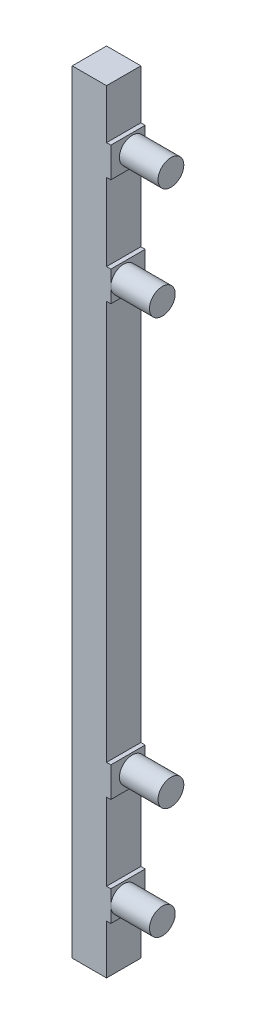
ISO-10303-21;
HEADER;
FILE_DESCRIPTION(('STEP AP214'),'2;1');
FILE_NAME('part.step','',(''),(''),'','','');
FILE_SCHEMA(('AUTOMOTIVE_DESIGN { 1 0 10303 214 1 1 1 1 }'));
ENDSEC;
DATA;
#1=APPLICATION_CONTEXT('core data for automotive mechanical design processes');
#2=APPLICATION_PROTOCOL_DEFINITION('international standard','automotive_design',2000,#1);
#3=PRODUCT_CONTEXT('',#1,'mechanical');
#4=PRODUCT('Part','Part','',(#3));
#5=PRODUCT_RELATED_PRODUCT_CATEGORY('part','',(#4));
#6=PRODUCT_DEFINITION_FORMATION('','',#4);
#7=PRODUCT_DEFINITION_CONTEXT('part definition',#1,'design');
#8=PRODUCT_DEFINITION('design','',#6,#7);
#9=PRODUCT_DEFINITION_SHAPE('','',#8);
#10=(LENGTH_UNIT() NAMED_UNIT(*) SI_UNIT(.MILLI.,.METRE.));
#11=(NAMED_UNIT(*) PLANE_ANGLE_UNIT() SI_UNIT($,.RADIAN.));
#12=(NAMED_UNIT(*) SI_UNIT($,.STERADIAN.) SOLID_ANGLE_UNIT());
#13=UNCERTAINTY_MEASURE_WITH_UNIT(LENGTH_MEASURE(1.E-05),#10,'distance_accuracy_value','');
#14=(GEOMETRIC_REPRESENTATION_CONTEXT(3) GLOBAL_UNCERTAINTY_ASSIGNED_CONTEXT((#13)) GLOBAL_UNIT_ASSIGNED_CONTEXT((#10,
#11,#12)) REPRESENTATION_CONTEXT('',''));
#15=CARTESIAN_POINT('',(0.,0.,0.));
#16=DIRECTION('',(0.,0.,1.));
#17=DIRECTION('',(1.,0.,0.));
#18=AXIS2_PLACEMENT_3D('',#15,#16,#17);
#19=CARTESIAN_POINT('',(8.,0.,0.));
#20=DIRECTION('',(1.,0.,0.));
#21=DIRECTION('',(0.,0.,-1.));
#22=AXIS2_PLACEMENT_3D('',#19,#20,#21);
#23=PLANE('',#22);
#24=DIRECTION('',(0.,0.,1.));
#25=VECTOR('',#24,1.);
#26=CARTESIAN_POINT('',(8.,-78.5,-4.));
#27=LINE('',#26,#25);
#28=CARTESIAN_POINT('',(8.,-78.5,-4.));
#29=VERTEX_POINT('',#28);
#30=CARTESIAN_POINT('',(8.,-78.5,4.));
#31=VERTEX_POINT('',#30);
#32=EDGE_CURVE('E223',#29,#31,#27,.T.);
#33=ORIENTED_EDGE('',*,*,#32,.T.);
#34=DIRECTION('',(0.,1.,0.));
#35=VECTOR('',#34,1.);
#36=CARTESIAN_POINT('',(8.,0.,4.));
#37=LINE('',#36,#35);
#38=CARTESIAN_POINT('',(8.,-90.,4.));
#39=VERTEX_POINT('',#38);
#40=EDGE_CURVE('E431',#39,#31,#37,.T.);
#41=ORIENTED_EDGE('',*,*,#40,.F.);
#42=DIRECTION('',(0.,0.,-1.));
#43=VECTOR('',#42,1.);
#44=CARTESIAN_POINT('',(8.,-90.,0.));
#45=LINE('',#44,#43);
#46=CARTESIAN_POINT('',(8.,-90.,-4.));
#47=VERTEX_POINT('',#46);
#48=EDGE_CURVE('E233',#39,#47,#45,.T.);
#49=ORIENTED_EDGE('',*,*,#48,.T.);
#50=DIRECTION('',(0.,1.,0.));
#51=VECTOR('',#50,1.);
#52=CARTESIAN_POINT('',(8.,0.,-4.));
#53=LINE('',#52,#51);
#54=EDGE_CURVE('E212',#47,#29,#53,.T.);
#55=ORIENTED_EDGE('',*,*,#54,.T.);
#56=EDGE_LOOP('',(#33,#41,#49,#55));
#57=FACE_BOUND('',#56,.T.);
#58=ADVANCED_FACE('F56',(#57),#23,.T.);
#59=DIRECTION('',(0.,0.,-1.));
#60=VECTOR('',#59,1.);
#61=CARTESIAN_POINT('',(8.,-46.5,0.));
#62=LINE('',#61,#60);
#63=CARTESIAN_POINT('',(8.,-46.5,4.));
#64=VERTEX_POINT('',#63);
#65=CARTESIAN_POINT('',(8.,-46.5,-4.));
#66=VERTEX_POINT('',#65);
#67=EDGE_CURVE('E353',#64,#66,#62,.T.);
#68=ORIENTED_EDGE('',*,*,#67,.T.);
#69=CARTESIAN_POINT('',(8.,46.5,-4.));
#70=VERTEX_POINT('',#69);
#71=EDGE_CURVE('E245',#66,#70,#53,.T.);
#72=ORIENTED_EDGE('',*,*,#71,.T.);
#73=DIRECTION('',(0.,0.,1.));
#74=VECTOR('',#73,1.);
#75=CARTESIAN_POINT('',(8.,46.5,0.));
#76=LINE('',#75,#74);
#77=CARTESIAN_POINT('',(8.,46.5,4.));
#78=VERTEX_POINT('',#77);
#79=EDGE_CURVE('E302',#70,#78,#76,.T.);
#80=ORIENTED_EDGE('',*,*,#79,.T.);
#81=EDGE_CURVE('E475',#64,#78,#37,.T.);
#82=ORIENTED_EDGE('',*,*,#81,.F.);
#83=EDGE_LOOP('',(#68,#72,#80,#82));
#84=FACE_BOUND('',#83,.T.);
#85=ADVANCED_FACE('F500',(#84),#23,.T.);
#86=DIRECTION('',(0.,0.,-1.));
#87=VECTOR('',#86,1.);
#88=CARTESIAN_POINT('',(8.,-71.5,4.));
#89=LINE('',#88,#87);
#90=CARTESIAN_POINT('',(8.,-71.5,4.));
#91=VERTEX_POINT('',#90);
#92=CARTESIAN_POINT('',(8.,-71.5,-4.));
#93=VERTEX_POINT('',#92);
#94=EDGE_CURVE('E72',#91,#93,#89,.T.);
#95=ORIENTED_EDGE('',*,*,#94,.T.);
#96=CARTESIAN_POINT('',(8.,-53.5,-4.));
#97=VERTEX_POINT('',#96);
#98=EDGE_CURVE('E237',#93,#97,#53,.T.);
#99=ORIENTED_EDGE('',*,*,#98,.T.);
#100=DIRECTION('',(0.,0.,1.));
#101=VECTOR('',#100,1.);
#102=CARTESIAN_POINT('',(8.,-53.5,0.));
#103=LINE('',#102,#101);
#104=CARTESIAN_POINT('',(8.,-53.5,4.));
#105=VERTEX_POINT('',#104);
#106=EDGE_CURVE('E357',#97,#105,#103,.T.);
#107=ORIENTED_EDGE('',*,*,#106,.T.);
#108=EDGE_CURVE('E467',#91,#105,#37,.T.);
#109=ORIENTED_EDGE('',*,*,#108,.F.);
#110=EDGE_LOOP('',(#95,#99,#107,#109));
#111=FACE_BOUND('',#110,.T.);
#112=ADVANCED_FACE('F473',(#111),#23,.T.);
#113=DIRECTION('',(0.,0.,-1.));
#114=VECTOR('',#113,1.);
#115=CARTESIAN_POINT('',(8.,78.5,0.));
#116=LINE('',#115,#114);
#117=CARTESIAN_POINT('',(8.,78.5,4.));
#118=VERTEX_POINT('',#117);
#119=CARTESIAN_POINT('',(8.,78.5,-4.));
#120=VERTEX_POINT('',#119);
#121=EDGE_CURVE('E299',#118,#120,#116,.T.);
#122=ORIENTED_EDGE('',*,*,#121,.T.);
#123=CARTESIAN_POINT('',(8.,90.,-4.));
#124=VERTEX_POINT('',#123);
#125=EDGE_CURVE('E239',#120,#124,#53,.T.);
#126=ORIENTED_EDGE('',*,*,#125,.T.);
#127=DIRECTION('',(0.,0.,-1.));
#128=VECTOR('',#127,1.);
#129=CARTESIAN_POINT('',(8.,90.,0.));
#130=LINE('',#129,#128);
#131=CARTESIAN_POINT('',(8.,90.,4.));
#132=VERTEX_POINT('',#131);
#133=EDGE_CURVE('E236',#132,#124,#130,.T.);
#134=ORIENTED_EDGE('',*,*,#133,.F.);
#135=EDGE_CURVE('E243',#118,#132,#37,.T.);
#136=ORIENTED_EDGE('',*,*,#135,.F.);
#137=EDGE_LOOP('',(#122,#126,#134,#136));
#138=FACE_BOUND('',#137,.T.);
#139=ADVANCED_FACE('F491',(#138),#23,.T.);
#140=CARTESIAN_POINT('',(8.,-90.,0.));
#141=DIRECTION('',(0.,1.,0.));
#142=DIRECTION('',(0.,0.,1.));
#143=AXIS2_PLACEMENT_3D('',#140,#141,#142);
#144=PLANE('',#143);
#145=DIRECTION('',(0.,0.,-1.));
#146=VECTOR('',#145,1.);
#147=CARTESIAN_POINT('',(0.,-90.,0.));
#148=LINE('',#147,#146);
#149=CARTESIAN_POINT('',(0.,-90.,4.));
#150=VERTEX_POINT('',#149);
#151=CARTESIAN_POINT('',(0.,-90.,-4.));
#152=VERTEX_POINT('',#151);
#153=EDGE_CURVE('E264',#150,#152,#148,.T.);
#154=ORIENTED_EDGE('',*,*,#153,.T.);
#155=DIRECTION('',(-1.,0.,0.));
#156=VECTOR('',#155,1.);
#157=CARTESIAN_POINT('',(8.,-90.,-4.));
#158=LINE('',#157,#156);
#159=EDGE_CURVE('E437',#47,#152,#158,.T.);
#160=ORIENTED_EDGE('',*,*,#159,.F.);
#161=ORIENTED_EDGE('',*,*,#48,.F.);
#162=DIRECTION('',(-1.,0.,0.));
#163=VECTOR('',#162,1.);
#164=CARTESIAN_POINT('',(8.,-90.,4.));
#165=LINE('',#164,#163);
#166=EDGE_CURVE('E427',#39,#150,#165,.T.);
#167=ORIENTED_EDGE('',*,*,#166,.T.);
#168=EDGE_LOOP('',(#154,#160,#161,#167));
#169=FACE_BOUND('',#168,.T.);
#170=ADVANCED_FACE('F58',(#169),#144,.F.);
#171=CARTESIAN_POINT('',(8.,0.,-4.));
#172=DIRECTION('',(0.,0.,1.));
#173=DIRECTION('',(1.,0.,0.));
#174=AXIS2_PLACEMENT_3D('',#171,#172,#173);
#175=PLANE('',#174);
#176=ORIENTED_EDGE('',*,*,#125,.F.);
#177=DIRECTION('',(-1.,0.,0.));
#178=VECTOR('',#177,1.);
#179=CARTESIAN_POINT('',(9.,78.5,-4.));
#180=LINE('',#179,#178);
#181=CARTESIAN_POINT('',(9.,78.5,-4.));
#182=VERTEX_POINT('',#181);
#183=EDGE_CURVE('E277',#182,#120,#180,.T.);
#184=ORIENTED_EDGE('',*,*,#183,.F.);
#185=DIRECTION('',(0.,1.,0.));
#186=VECTOR('',#185,1.);
#187=CARTESIAN_POINT('',(9.,0.,-4.));
#188=LINE('',#187,#186);
#189=CARTESIAN_POINT('',(9.,75.,-4.));
#190=VERTEX_POINT('',#189);
#191=EDGE_CURVE('E298',#190,#182,#188,.T.);
#192=ORIENTED_EDGE('',*,*,#191,.F.);
#193=CARTESIAN_POINT('',(9.,71.5,-4.));
#194=VERTEX_POINT('',#193);
#195=EDGE_CURVE('E313',#194,#190,#188,.T.);
#196=ORIENTED_EDGE('',*,*,#195,.F.);
#197=DIRECTION('',(-1.,0.,0.));
#198=VECTOR('',#197,1.);
#199=CARTESIAN_POINT('',(9.,71.5,-4.));
#200=LINE('',#199,#198);
#201=CARTESIAN_POINT('',(8.,71.5,-4.));
#202=VERTEX_POINT('',#201);
#203=EDGE_CURVE('E289',#194,#202,#200,.T.);
#204=ORIENTED_EDGE('',*,*,#203,.T.);
#205=CARTESIAN_POINT('',(8.,53.5,-4.));
#206=VERTEX_POINT('',#205);
#207=EDGE_CURVE('E248',#206,#202,#53,.T.);
#208=ORIENTED_EDGE('',*,*,#207,.F.);
#209=DIRECTION('',(-1.,0.,0.));
#210=VECTOR('',#209,1.);
#211=CARTESIAN_POINT('',(9.,53.5,-4.));
#212=LINE('',#211,#210);
#213=CARTESIAN_POINT('',(9.,53.5,-4.));
#214=VERTEX_POINT('',#213);
#215=EDGE_CURVE('E341',#214,#206,#212,.T.);
#216=ORIENTED_EDGE('',*,*,#215,.F.);
#217=DIRECTION('',(0.,1.,0.));
#218=VECTOR('',#217,1.);
#219=CARTESIAN_POINT('',(9.,0.,-4.));
#220=LINE('',#219,#218);
#221=CARTESIAN_POINT('',(9.,46.5,-4.));
#222=VERTEX_POINT('',#221);
#223=EDGE_CURVE('E325',#222,#214,#220,.T.);
#224=ORIENTED_EDGE('',*,*,#223,.F.);
#225=DIRECTION('',(-1.,0.,0.));
#226=VECTOR('',#225,1.);
#227=CARTESIAN_POINT('',(9.,46.5,-4.));
#228=LINE('',#227,#226);
#229=EDGE_CURVE('E345',#222,#70,#228,.T.);
#230=ORIENTED_EDGE('',*,*,#229,.T.);
#231=ORIENTED_EDGE('',*,*,#71,.F.);
#232=DIRECTION('',(-1.,0.,0.));
#233=VECTOR('',#232,1.);
#234=CARTESIAN_POINT('',(9.,-46.5,-4.));
#235=LINE('',#234,#233);
#236=CARTESIAN_POINT('',(9.,-46.5,-4.));
#237=VERTEX_POINT('',#236);
#238=EDGE_CURVE('E230',#237,#66,#235,.T.);
#239=ORIENTED_EDGE('',*,*,#238,.F.);
#240=DIRECTION('',(0.,1.,0.));
#241=VECTOR('',#240,1.);
#242=CARTESIAN_POINT('',(9.,0.,-4.));
#243=LINE('',#242,#241);
#244=CARTESIAN_POINT('',(9.,-50.,-4.));
#245=VERTEX_POINT('',#244);
#246=EDGE_CURVE('E358',#245,#237,#243,.T.);
#247=ORIENTED_EDGE('',*,*,#246,.F.);
#248=CARTESIAN_POINT('',(9.,-53.5,-4.));
#249=VERTEX_POINT('',#248);
#250=EDGE_CURVE('E354',#249,#245,#243,.T.);
#251=ORIENTED_EDGE('',*,*,#250,.F.);
#252=DIRECTION('',(-1.,0.,0.));
#253=VECTOR('',#252,1.);
#254=CARTESIAN_POINT('',(9.,-53.5,-4.));
#255=LINE('',#254,#253);
#256=EDGE_CURVE('E370',#249,#97,#255,.T.);
#257=ORIENTED_EDGE('',*,*,#256,.T.);
#258=ORIENTED_EDGE('',*,*,#98,.F.);
#259=DIRECTION('',(-1.,0.,0.));
#260=VECTOR('',#259,1.);
#261=CARTESIAN_POINT('',(9.,-71.5,-4.));
#262=LINE('',#261,#260);
#263=CARTESIAN_POINT('',(9.,-71.5,-4.));
#264=VERTEX_POINT('',#263);
#265=EDGE_CURVE('E220',#264,#93,#262,.T.);
#266=ORIENTED_EDGE('',*,*,#265,.F.);
#267=DIRECTION('',(0.,-1.,0.));
#268=VECTOR('',#267,1.);
#269=CARTESIAN_POINT('',(9.,-71.5,-4.));
#270=LINE('',#269,#268);
#271=CARTESIAN_POINT('',(9.,-78.5,-4.));
#272=VERTEX_POINT('',#271);
#273=EDGE_CURVE('E215',#264,#272,#270,.T.);
#274=ORIENTED_EDGE('',*,*,#273,.T.);
#275=DIRECTION('',(-1.,0.,0.));
#276=VECTOR('',#275,1.);
#277=CARTESIAN_POINT('',(9.,-78.5,-4.));
#278=LINE('',#277,#276);
#279=EDGE_CURVE('E206',#272,#29,#278,.T.);
#280=ORIENTED_EDGE('',*,*,#279,.T.);
#281=ORIENTED_EDGE('',*,*,#54,.F.);
#282=ORIENTED_EDGE('',*,*,#159,.T.);
#283=DIRECTION('',(0.,1.,0.));
#284=VECTOR('',#283,1.);
#285=CARTESIAN_POINT('',(0.,0.,-4.));
#286=LINE('',#285,#284);
#287=CARTESIAN_POINT('',(0.,90.,-4.));
#288=VERTEX_POINT('',#287);
#289=EDGE_CURVE('E417',#152,#288,#286,.T.);
#290=ORIENTED_EDGE('',*,*,#289,.T.);
#291=DIRECTION('',(-1.,0.,0.));
#292=VECTOR('',#291,1.);
#293=CARTESIAN_POINT('',(8.,90.,-4.));
#294=LINE('',#293,#292);
#295=EDGE_CURVE('E434',#124,#288,#294,.T.);
#296=ORIENTED_EDGE('',*,*,#295,.F.);
#297=EDGE_LOOP('',(#176,#184,#192,#196,#204,#208,#216,#224,#230,#231,#239,#247,#251,#257,#258,
#266,#274,#280,#281,#282,#290,#296));
#298=FACE_BOUND('',#297,.T.);
#299=ADVANCED_FACE('F209',(#298),#175,.F.);
#300=CARTESIAN_POINT('',(8.,90.,0.));
#301=DIRECTION('',(0.,1.,0.));
#302=DIRECTION('',(0.,0.,1.));
#303=AXIS2_PLACEMENT_3D('',#300,#301,#302);
#304=PLANE('',#303);
#305=DIRECTION('',(0.,0.,-1.));
#306=VECTOR('',#305,1.);
#307=CARTESIAN_POINT('',(0.,90.,0.));
#308=LINE('',#307,#306);
#309=CARTESIAN_POINT('',(0.,90.,4.));
#310=VERTEX_POINT('',#309);
#311=EDGE_CURVE('E257',#310,#288,#308,.T.);
#312=ORIENTED_EDGE('',*,*,#311,.F.);
#313=DIRECTION('',(-1.,0.,0.));
#314=VECTOR('',#313,1.);
#315=CARTESIAN_POINT('',(8.,90.,4.));
#316=LINE('',#315,#314);
#317=EDGE_CURVE('E430',#132,#310,#316,.T.);
#318=ORIENTED_EDGE('',*,*,#317,.F.);
#319=ORIENTED_EDGE('',*,*,#133,.T.);
#320=ORIENTED_EDGE('',*,*,#295,.T.);
#321=EDGE_LOOP('',(#312,#318,#319,#320));
#322=FACE_BOUND('',#321,.T.);
#323=ADVANCED_FACE('F490',(#322),#304,.T.);
#324=CARTESIAN_POINT('',(8.,0.,4.));
#325=DIRECTION('',(0.,0.,1.));
#326=DIRECTION('',(1.,0.,0.));
#327=AXIS2_PLACEMENT_3D('',#324,#325,#326);
#328=PLANE('',#327);
#329=ORIENTED_EDGE('',*,*,#40,.T.);
#330=DIRECTION('',(-1.,0.,0.));
#331=VECTOR('',#330,1.);
#332=CARTESIAN_POINT('',(9.,-78.5,4.));
#333=LINE('',#332,#331);
#334=CARTESIAN_POINT('',(9.,-78.5,4.));
#335=VERTEX_POINT('',#334);
#336=EDGE_CURVE('E225',#335,#31,#333,.T.);
#337=ORIENTED_EDGE('',*,*,#336,.F.);
#338=DIRECTION('',(0.,1.,0.));
#339=VECTOR('',#338,1.);
#340=CARTESIAN_POINT('',(9.,-78.5,4.));
#341=LINE('',#340,#339);
#342=CARTESIAN_POINT('',(9.,-75.,4.));
#343=VERTEX_POINT('',#342);
#344=EDGE_CURVE('E80',#335,#343,#341,.T.);
#345=ORIENTED_EDGE('',*,*,#344,.T.);
#346=CARTESIAN_POINT('',(9.,-71.5,4.));
#347=VERTEX_POINT('',#346);
#348=EDGE_CURVE('E395',#343,#347,#341,.T.);
#349=ORIENTED_EDGE('',*,*,#348,.T.);
#350=DIRECTION('',(-1.,0.,0.));
#351=VECTOR('',#350,1.);
#352=CARTESIAN_POINT('',(9.,-71.5,4.));
#353=LINE('',#352,#351);
#354=EDGE_CURVE('E406',#347,#91,#353,.T.);
#355=ORIENTED_EDGE('',*,*,#354,.T.);
#356=ORIENTED_EDGE('',*,*,#108,.T.);
#357=DIRECTION('',(-1.,0.,0.));
#358=VECTOR('',#357,1.);
#359=CARTESIAN_POINT('',(9.,-53.5,4.));
#360=LINE('',#359,#358);
#361=CARTESIAN_POINT('',(9.,-53.5,4.));
#362=VERTEX_POINT('',#361);
#363=EDGE_CURVE('E380',#362,#105,#360,.T.);
#364=ORIENTED_EDGE('',*,*,#363,.F.);
#365=DIRECTION('',(0.,-1.,0.));
#366=VECTOR('',#365,1.);
#367=CARTESIAN_POINT('',(9.,0.,4.));
#368=LINE('',#367,#366);
#369=CARTESIAN_POINT('',(9.,-46.5,4.));
#370=VERTEX_POINT('',#369);
#371=EDGE_CURVE('E363',#370,#362,#368,.T.);
#372=ORIENTED_EDGE('',*,*,#371,.F.);
#373=DIRECTION('',(-1.,0.,0.));
#374=VECTOR('',#373,1.);
#375=CARTESIAN_POINT('',(9.,-46.5,4.));
#376=LINE('',#375,#374);
#377=EDGE_CURVE('E384',#370,#64,#376,.T.);
#378=ORIENTED_EDGE('',*,*,#377,.T.);
#379=ORIENTED_EDGE('',*,*,#81,.T.);
#380=DIRECTION('',(-1.,0.,0.));
#381=VECTOR('',#380,1.);
#382=CARTESIAN_POINT('',(9.,46.5,4.));
#383=LINE('',#382,#381);
#384=CARTESIAN_POINT('',(9.,46.5,4.));
#385=VERTEX_POINT('',#384);
#386=EDGE_CURVE('E349',#385,#78,#383,.T.);
#387=ORIENTED_EDGE('',*,*,#386,.F.);
#388=DIRECTION('',(0.,-1.,0.));
#389=VECTOR('',#388,1.);
#390=CARTESIAN_POINT('',(9.,0.,4.));
#391=LINE('',#390,#389);
#392=CARTESIAN_POINT('',(9.,50.,4.));
#393=VERTEX_POINT('',#392);
#394=EDGE_CURVE('E320',#393,#385,#391,.T.);
#395=ORIENTED_EDGE('',*,*,#394,.F.);
#396=CARTESIAN_POINT('',(9.,53.5,4.));
#397=VERTEX_POINT('',#396);
#398=EDGE_CURVE('E316',#397,#393,#391,.T.);
#399=ORIENTED_EDGE('',*,*,#398,.F.);
#400=DIRECTION('',(-1.,0.,0.));
#401=VECTOR('',#400,1.);
#402=CARTESIAN_POINT('',(9.,53.5,4.));
#403=LINE('',#402,#401);
#404=CARTESIAN_POINT('',(8.,53.5,4.));
#405=VERTEX_POINT('',#404);
#406=EDGE_CURVE('E332',#397,#405,#403,.T.);
#407=ORIENTED_EDGE('',*,*,#406,.T.);
#408=CARTESIAN_POINT('',(8.,71.5,4.));
#409=VERTEX_POINT('',#408);
#410=EDGE_CURVE('E479',#405,#409,#37,.T.);
#411=ORIENTED_EDGE('',*,*,#410,.T.);
#412=DIRECTION('',(-1.,0.,0.));
#413=VECTOR('',#412,1.);
#414=CARTESIAN_POINT('',(9.,71.5,4.));
#415=LINE('',#414,#413);
#416=CARTESIAN_POINT('',(9.,71.5,4.));
#417=VERTEX_POINT('',#416);
#418=EDGE_CURVE('E285',#417,#409,#415,.T.);
#419=ORIENTED_EDGE('',*,*,#418,.F.);
#420=DIRECTION('',(0.,-1.,0.));
#421=VECTOR('',#420,1.);
#422=CARTESIAN_POINT('',(9.,0.,4.));
#423=LINE('',#422,#421);
#424=CARTESIAN_POINT('',(9.,78.5,4.));
#425=VERTEX_POINT('',#424);
#426=EDGE_CURVE('E306',#425,#417,#423,.T.);
#427=ORIENTED_EDGE('',*,*,#426,.F.);
#428=DIRECTION('',(-1.,0.,0.));
#429=VECTOR('',#428,1.);
#430=CARTESIAN_POINT('',(9.,78.5,4.));
#431=LINE('',#430,#429);
#432=EDGE_CURVE('E281',#425,#118,#431,.T.);
#433=ORIENTED_EDGE('',*,*,#432,.T.);
#434=ORIENTED_EDGE('',*,*,#135,.T.);
#435=ORIENTED_EDGE('',*,*,#317,.T.);
#436=DIRECTION('',(0.,1.,0.));
#437=VECTOR('',#436,1.);
#438=CARTESIAN_POINT('',(0.,0.,4.));
#439=LINE('',#438,#437);
#440=EDGE_CURVE('E254',#150,#310,#439,.T.);
#441=ORIENTED_EDGE('',*,*,#440,.F.);
#442=ORIENTED_EDGE('',*,*,#166,.F.);
#443=EDGE_LOOP('',(#329,#337,#345,#349,#355,#356,#364,#372,#378,#379,#387,#395,#399,#407,#411,
#419,#427,#433,#434,#435,#441,#442));
#444=FACE_BOUND('',#443,.T.);
#445=ADVANCED_FACE('F465',(#444),#328,.T.);
#446=DIRECTION('',(0.,0.,-1.));
#447=VECTOR('',#446,1.);
#448=CARTESIAN_POINT('',(8.,53.5,0.));
#449=LINE('',#448,#447);
#450=EDGE_CURVE('E319',#405,#206,#449,.T.);
#451=ORIENTED_EDGE('',*,*,#450,.T.);
#452=ORIENTED_EDGE('',*,*,#207,.T.);
#453=DIRECTION('',(0.,0.,1.));
#454=VECTOR('',#453,1.);
#455=CARTESIAN_POINT('',(8.,71.5,0.));
#456=LINE('',#455,#454);
#457=EDGE_CURVE('E294',#202,#409,#456,.T.);
#458=ORIENTED_EDGE('',*,*,#457,.T.);
#459=ORIENTED_EDGE('',*,*,#410,.F.);
#460=EDGE_LOOP('',(#451,#452,#458,#459));
#461=FACE_BOUND('',#460,.T.);
#462=ADVANCED_FACE('F494',(#461),#23,.T.);
#463=CARTESIAN_POINT('',(0.,0.,0.));
#464=DIRECTION('',(1.,0.,0.));
#465=DIRECTION('',(0.,0.,-1.));
#466=AXIS2_PLACEMENT_3D('',#463,#464,#465);
#467=PLANE('',#466);
#468=ORIENTED_EDGE('',*,*,#153,.F.);
#469=ORIENTED_EDGE('',*,*,#440,.T.);
#470=ORIENTED_EDGE('',*,*,#311,.T.);
#471=ORIENTED_EDGE('',*,*,#289,.F.);
#472=EDGE_LOOP('',(#468,#469,#470,#471));
#473=FACE_BOUND('',#472,.T.);
#474=ADVANCED_FACE('F504',(#473),#467,.F.);
#475=CARTESIAN_POINT('',(9.,78.5,0.));
#476=DIRECTION('',(0.,1.,0.));
#477=DIRECTION('',(0.,0.,1.));
#478=AXIS2_PLACEMENT_3D('',#475,#476,#477);
#479=PLANE('',#478);
#480=ORIENTED_EDGE('',*,*,#121,.F.);
#481=ORIENTED_EDGE('',*,*,#432,.F.);
#482=DIRECTION('',(0.,0.,-1.));
#483=VECTOR('',#482,1.);
#484=CARTESIAN_POINT('',(9.,78.5,0.));
#485=LINE('',#484,#483);
#486=EDGE_CURVE('E309',#425,#182,#485,.T.);
#487=ORIENTED_EDGE('',*,*,#486,.T.);
#488=ORIENTED_EDGE('',*,*,#183,.T.);
#489=EDGE_LOOP('',(#480,#481,#487,#488));
#490=FACE_BOUND('',#489,.T.);
#491=ADVANCED_FACE('F592',(#490),#479,.T.);
#492=CARTESIAN_POINT('',(9.,71.5,0.));
#493=DIRECTION('',(0.,-1.,0.));
#494=DIRECTION('',(0.,0.,-1.));
#495=AXIS2_PLACEMENT_3D('',#492,#493,#494);
#496=PLANE('',#495);
#497=ORIENTED_EDGE('',*,*,#457,.F.);
#498=ORIENTED_EDGE('',*,*,#203,.F.);
#499=DIRECTION('',(0.,0.,1.));
#500=VECTOR('',#499,1.);
#501=CARTESIAN_POINT('',(9.,71.5,0.));
#502=LINE('',#501,#500);
#503=EDGE_CURVE('E293',#194,#417,#502,.T.);
#504=ORIENTED_EDGE('',*,*,#503,.T.);
#505=ORIENTED_EDGE('',*,*,#418,.T.);
#506=EDGE_LOOP('',(#497,#498,#504,#505));
#507=FACE_BOUND('',#506,.T.);
#508=ADVANCED_FACE('F588',(#507),#496,.T.);
#509=CARTESIAN_POINT('',(9.,0.,0.));
#510=DIRECTION('',(1.,0.,0.));
#511=DIRECTION('',(0.,0.,-1.));
#512=AXIS2_PLACEMENT_3D('',#509,#510,#511);
#513=PLANE('',#512);
#514=ORIENTED_EDGE('',*,*,#195,.T.);
#515=CARTESIAN_POINT('',(9.,75.,-1.));
#516=DIRECTION('',(1.,0.,0.));
#517=DIRECTION('',(0.,0.,-1.));
#518=AXIS2_PLACEMENT_3D('',#515,#516,#517);
#519=CIRCLE('',#518,3.);
#520=EDGE_CURVE('E440',#190,#190,#519,.T.);
#521=ORIENTED_EDGE('',*,*,#520,.F.);
#522=ORIENTED_EDGE('',*,*,#191,.T.);
#523=ORIENTED_EDGE('',*,*,#486,.F.);
#524=ORIENTED_EDGE('',*,*,#426,.T.);
#525=ORIENTED_EDGE('',*,*,#503,.F.);
#526=EDGE_LOOP('',(#514,#521,#522,#523,#524,#525));
#527=FACE_BOUND('',#526,.T.);
#528=ADVANCED_FACE('F584',(#527),#513,.T.);
#529=CARTESIAN_POINT('',(18.,75.,-1.));
#530=DIRECTION('',(1.,0.,0.));
#531=DIRECTION('',(0.,0.,-1.));
#532=AXIS2_PLACEMENT_3D('',#529,#530,#531);
#533=PLANE('',#532);
#534=CARTESIAN_POINT('',(18.,75.,-1.));
#535=DIRECTION('',(1.,0.,0.));
#536=DIRECTION('',(0.,0.,-1.));
#537=AXIS2_PLACEMENT_3D('',#534,#535,#536);
#538=CIRCLE('',#537,3.);
#539=CARTESIAN_POINT('',(18.,75.,-4.00000000000001));
#540=VERTEX_POINT('',#539);
#541=EDGE_CURVE('E273',#540,#540,#538,.T.);
#542=ORIENTED_EDGE('',*,*,#541,.T.);
#543=EDGE_LOOP('',(#542));
#544=FACE_BOUND('',#543,.T.);
#545=ADVANCED_FACE('F587',(#544),#533,.T.);
#546=CARTESIAN_POINT('',(18.,75.,-1.));
#547=DIRECTION('',(-1.,0.,0.));
#548=DIRECTION('',(0.,0.,1.));
#549=AXIS2_PLACEMENT_3D('',#546,#547,#548);
#550=CYLINDRICAL_SURFACE('',#549,3.);
#551=ORIENTED_EDGE('',*,*,#520,.T.);
#552=EDGE_LOOP('',(#551));
#553=FACE_BOUND('',#552,.T.);
#554=ORIENTED_EDGE('',*,*,#541,.F.);
#555=EDGE_LOOP('',(#554));
#556=FACE_BOUND('',#555,.T.);
#557=ADVANCED_FACE('F580',(#553,#556),#550,.T.);
#558=CARTESIAN_POINT('',(9.,46.5,0.));
#559=DIRECTION('',(0.,-1.,0.));
#560=DIRECTION('',(0.,0.,-1.));
#561=AXIS2_PLACEMENT_3D('',#558,#559,#560);
#562=PLANE('',#561);
#563=ORIENTED_EDGE('',*,*,#79,.F.);
#564=ORIENTED_EDGE('',*,*,#229,.F.);
#565=DIRECTION('',(0.,0.,1.));
#566=VECTOR('',#565,1.);
#567=CARTESIAN_POINT('',(9.,46.5,0.));
#568=LINE('',#567,#566);
#569=EDGE_CURVE('E321',#222,#385,#568,.T.);
#570=ORIENTED_EDGE('',*,*,#569,.T.);
#571=ORIENTED_EDGE('',*,*,#386,.T.);
#572=EDGE_LOOP('',(#563,#564,#570,#571));
#573=FACE_BOUND('',#572,.T.);
#574=ADVANCED_FACE('F515',(#573),#562,.T.);
#575=CARTESIAN_POINT('',(9.,53.5,0.));
#576=DIRECTION('',(0.,1.,0.));
#577=DIRECTION('',(0.,0.,1.));
#578=AXIS2_PLACEMENT_3D('',#575,#576,#577);
#579=PLANE('',#578);
#580=ORIENTED_EDGE('',*,*,#450,.F.);
#581=ORIENTED_EDGE('',*,*,#406,.F.);
#582=DIRECTION('',(0.,0.,-1.));
#583=VECTOR('',#582,1.);
#584=CARTESIAN_POINT('',(9.,53.5,0.));
#585=LINE('',#584,#583);
#586=EDGE_CURVE('E328',#397,#214,#585,.T.);
#587=ORIENTED_EDGE('',*,*,#586,.T.);
#588=ORIENTED_EDGE('',*,*,#215,.T.);
#589=EDGE_LOOP('',(#580,#581,#587,#588));
#590=FACE_BOUND('',#589,.T.);
#591=ADVANCED_FACE('F536',(#590),#579,.T.);
#592=CARTESIAN_POINT('',(9.,0.,0.));
#593=DIRECTION('',(1.,0.,0.));
#594=DIRECTION('',(0.,0.,-1.));
#595=AXIS2_PLACEMENT_3D('',#592,#593,#594);
#596=PLANE('',#595);
#597=ORIENTED_EDGE('',*,*,#398,.T.);
#598=CARTESIAN_POINT('',(9.,50.,1.));
#599=DIRECTION('',(1.,0.,0.));
#600=DIRECTION('',(0.,0.,-1.));
#601=AXIS2_PLACEMENT_3D('',#598,#599,#600);
#602=CIRCLE('',#601,3.);
#603=EDGE_CURVE('E444',#393,#393,#602,.T.);
#604=ORIENTED_EDGE('',*,*,#603,.F.);
#605=ORIENTED_EDGE('',*,*,#394,.T.);
#606=ORIENTED_EDGE('',*,*,#569,.F.);
#607=ORIENTED_EDGE('',*,*,#223,.T.);
#608=ORIENTED_EDGE('',*,*,#586,.F.);
#609=EDGE_LOOP('',(#597,#604,#605,#606,#607,#608));
#610=FACE_BOUND('',#609,.T.);
#611=ADVANCED_FACE('F522',(#610),#596,.T.);
#612=CARTESIAN_POINT('',(18.,0.,0.));
#613=DIRECTION('',(1.,0.,0.));
#614=DIRECTION('',(0.,0.,-1.));
#615=AXIS2_PLACEMENT_3D('',#612,#613,#614);
#616=PLANE('',#615);
#617=CARTESIAN_POINT('',(18.,50.,1.));
#618=DIRECTION('',(1.,0.,0.));
#619=DIRECTION('',(0.,0.,-1.));
#620=AXIS2_PLACEMENT_3D('',#617,#618,#619);
#621=CIRCLE('',#620,3.);
#622=CARTESIAN_POINT('',(18.,50.,-2.));
#623=VERTEX_POINT('',#622);
#624=EDGE_CURVE('E269',#623,#623,#621,.T.);
#625=ORIENTED_EDGE('',*,*,#624,.T.);
#626=EDGE_LOOP('',(#625));
#627=FACE_BOUND('',#626,.T.);
#628=ADVANCED_FACE('F527',(#627),#616,.T.);
#629=CARTESIAN_POINT('',(18.,50.,1.));
#630=DIRECTION('',(-1.,0.,0.));
#631=DIRECTION('',(0.,0.,1.));
#632=AXIS2_PLACEMENT_3D('',#629,#630,#631);
#633=CYLINDRICAL_SURFACE('',#632,3.);
#634=ORIENTED_EDGE('',*,*,#603,.T.);
#635=EDGE_LOOP('',(#634));
#636=FACE_BOUND('',#635,.T.);
#637=ORIENTED_EDGE('',*,*,#624,.F.);
#638=EDGE_LOOP('',(#637));
#639=FACE_BOUND('',#638,.T.);
#640=ADVANCED_FACE('F524',(#636,#639),#633,.T.);
#641=CARTESIAN_POINT('',(9.,-46.5,0.));
#642=DIRECTION('',(0.,1.,0.));
#643=DIRECTION('',(0.,0.,1.));
#644=AXIS2_PLACEMENT_3D('',#641,#642,#643);
#645=PLANE('',#644);
#646=ORIENTED_EDGE('',*,*,#67,.F.);
#647=ORIENTED_EDGE('',*,*,#377,.F.);
#648=DIRECTION('',(0.,0.,-1.));
#649=VECTOR('',#648,1.);
#650=CARTESIAN_POINT('',(9.,-46.5,0.));
#651=LINE('',#650,#649);
#652=EDGE_CURVE('E359',#370,#237,#651,.T.);
#653=ORIENTED_EDGE('',*,*,#652,.T.);
#654=ORIENTED_EDGE('',*,*,#238,.T.);
#655=EDGE_LOOP('',(#646,#647,#653,#654));
#656=FACE_BOUND('',#655,.T.);
#657=ADVANCED_FACE('F462',(#656),#645,.T.);
#658=CARTESIAN_POINT('',(9.,-53.5,0.));
#659=DIRECTION('',(0.,-1.,0.));
#660=DIRECTION('',(0.,0.,-1.));
#661=AXIS2_PLACEMENT_3D('',#658,#659,#660);
#662=PLANE('',#661);
#663=ORIENTED_EDGE('',*,*,#106,.F.);
#664=ORIENTED_EDGE('',*,*,#256,.F.);
#665=DIRECTION('',(0.,0.,1.));
#666=VECTOR('',#665,1.);
#667=CARTESIAN_POINT('',(9.,-53.5,0.));
#668=LINE('',#667,#666);
#669=EDGE_CURVE('E366',#249,#362,#668,.T.);
#670=ORIENTED_EDGE('',*,*,#669,.T.);
#671=ORIENTED_EDGE('',*,*,#363,.T.);
#672=EDGE_LOOP('',(#663,#664,#670,#671));
#673=FACE_BOUND('',#672,.T.);
#674=ADVANCED_FACE('F470',(#673),#662,.T.);
#675=CARTESIAN_POINT('',(9.,0.,0.));
#676=DIRECTION('',(1.,0.,0.));
#677=DIRECTION('',(0.,0.,-1.));
#678=AXIS2_PLACEMENT_3D('',#675,#676,#677);
#679=PLANE('',#678);
#680=ORIENTED_EDGE('',*,*,#250,.T.);
#681=CARTESIAN_POINT('',(9.,-50.,-1.));
#682=DIRECTION('',(1.,0.,0.));
#683=DIRECTION('',(0.,0.,-1.));
#684=AXIS2_PLACEMENT_3D('',#681,#682,#683);
#685=CIRCLE('',#684,3.);
#686=EDGE_CURVE('E65',#245,#245,#685,.T.);
#687=ORIENTED_EDGE('',*,*,#686,.F.);
#688=ORIENTED_EDGE('',*,*,#246,.T.);
#689=ORIENTED_EDGE('',*,*,#652,.F.);
#690=ORIENTED_EDGE('',*,*,#371,.T.);
#691=ORIENTED_EDGE('',*,*,#669,.F.);
#692=EDGE_LOOP('',(#680,#687,#688,#689,#690,#691));
#693=FACE_BOUND('',#692,.T.);
#694=ADVANCED_FACE('F454',(#693),#679,.T.);
#695=CARTESIAN_POINT('',(18.,0.,0.));
#696=DIRECTION('',(1.,0.,0.));
#697=DIRECTION('',(0.,0.,-1.));
#698=AXIS2_PLACEMENT_3D('',#695,#696,#697);
#699=PLANE('',#698);
#700=CARTESIAN_POINT('',(18.,-50.,-1.));
#701=DIRECTION('',(1.,0.,0.));
#702=DIRECTION('',(0.,0.,-1.));
#703=AXIS2_PLACEMENT_3D('',#700,#701,#702);
#704=CIRCLE('',#703,3.);
#705=CARTESIAN_POINT('',(18.,-50.,-4.));
#706=VERTEX_POINT('',#705);
#707=EDGE_CURVE('E265',#706,#706,#704,.T.);
#708=ORIENTED_EDGE('',*,*,#707,.T.);
#709=EDGE_LOOP('',(#708));
#710=FACE_BOUND('',#709,.T.);
#711=ADVANCED_FACE('F543',(#710),#699,.T.);
#712=CARTESIAN_POINT('',(18.,-50.,-1.));
#713=DIRECTION('',(-1.,0.,0.));
#714=DIRECTION('',(0.,0.,1.));
#715=AXIS2_PLACEMENT_3D('',#712,#713,#714);
#716=CYLINDRICAL_SURFACE('',#715,3.);
#717=ORIENTED_EDGE('',*,*,#686,.T.);
#718=EDGE_LOOP('',(#717));
#719=FACE_BOUND('',#718,.T.);
#720=ORIENTED_EDGE('',*,*,#707,.F.);
#721=EDGE_LOOP('',(#720));
#722=FACE_BOUND('',#721,.T.);
#723=ADVANCED_FACE('F451',(#719,#722),#716,.T.);
#724=CARTESIAN_POINT('',(9.,0.,0.));
#725=DIRECTION('',(1.,0.,0.));
#726=DIRECTION('',(0.,0.,-1.));
#727=AXIS2_PLACEMENT_3D('',#724,#725,#726);
#728=PLANE('',#727);
#729=ORIENTED_EDGE('',*,*,#348,.F.);
#730=CARTESIAN_POINT('',(9.,-75.,1.));
#731=DIRECTION('',(1.,0.,0.));
#732=DIRECTION('',(0.,0.,-1.));
#733=AXIS2_PLACEMENT_3D('',#730,#731,#732);
#734=CIRCLE('',#733,3.);
#735=EDGE_CURVE('E12',#343,#343,#734,.T.);
#736=ORIENTED_EDGE('',*,*,#735,.F.);
#737=ORIENTED_EDGE('',*,*,#344,.F.);
#738=DIRECTION('',(0.,0.,1.));
#739=VECTOR('',#738,1.);
#740=CARTESIAN_POINT('',(9.,-78.5,-4.));
#741=LINE('',#740,#739);
#742=EDGE_CURVE('E390',#272,#335,#741,.T.);
#743=ORIENTED_EDGE('',*,*,#742,.F.);
#744=ORIENTED_EDGE('',*,*,#273,.F.);
#745=DIRECTION('',(0.,0.,-1.));
#746=VECTOR('',#745,1.);
#747=CARTESIAN_POINT('',(9.,-71.5,4.));
#748=LINE('',#747,#746);
#749=EDGE_CURVE('E396',#347,#264,#748,.T.);
#750=ORIENTED_EDGE('',*,*,#749,.F.);
#751=EDGE_LOOP('',(#729,#736,#737,#743,#744,#750));
#752=FACE_BOUND('',#751,.T.);
#753=ADVANCED_FACE('F542',(#752),#728,.T.);
#754=CARTESIAN_POINT('',(9.,-78.5,-4.));
#755=DIRECTION('',(0.,-1.,0.));
#756=DIRECTION('',(0.,0.,-1.));
#757=AXIS2_PLACEMENT_3D('',#754,#755,#756);
#758=PLANE('',#757);
#759=ORIENTED_EDGE('',*,*,#32,.F.);
#760=ORIENTED_EDGE('',*,*,#279,.F.);
#761=ORIENTED_EDGE('',*,*,#742,.T.);
#762=ORIENTED_EDGE('',*,*,#336,.T.);
#763=EDGE_LOOP('',(#759,#760,#761,#762));
#764=FACE_BOUND('',#763,.T.);
#765=ADVANCED_FACE('F224',(#764),#758,.T.);
#766=CARTESIAN_POINT('',(9.,-71.5,4.));
#767=DIRECTION('',(0.,1.,0.));
#768=DIRECTION('',(0.,0.,1.));
#769=AXIS2_PLACEMENT_3D('',#766,#767,#768);
#770=PLANE('',#769);
#771=ORIENTED_EDGE('',*,*,#94,.F.);
#772=ORIENTED_EDGE('',*,*,#354,.F.);
#773=ORIENTED_EDGE('',*,*,#749,.T.);
#774=ORIENTED_EDGE('',*,*,#265,.T.);
#775=EDGE_LOOP('',(#771,#772,#773,#774));
#776=FACE_BOUND('',#775,.T.);
#777=ADVANCED_FACE('F550',(#776),#770,.T.);
#778=CARTESIAN_POINT('',(18.,0.,0.));
#779=DIRECTION('',(1.,0.,0.));
#780=DIRECTION('',(0.,0.,-1.));
#781=AXIS2_PLACEMENT_3D('',#778,#779,#780);
#782=PLANE('',#781);
#783=CARTESIAN_POINT('',(18.,-75.,1.));
#784=DIRECTION('',(1.,0.,0.));
#785=DIRECTION('',(0.,0.,-1.));
#786=AXIS2_PLACEMENT_3D('',#783,#784,#785);
#787=CIRCLE('',#786,3.);
#788=CARTESIAN_POINT('',(18.,-75.,-2.));
#789=VERTEX_POINT('',#788);
#790=EDGE_CURVE('E260',#789,#789,#787,.T.);
#791=ORIENTED_EDGE('',*,*,#790,.T.);
#792=EDGE_LOOP('',(#791));
#793=FACE_BOUND('',#792,.T.);
#794=ADVANCED_FACE('F547',(#793),#782,.T.);
#795=CARTESIAN_POINT('',(18.,-75.,1.));
#796=DIRECTION('',(-1.,0.,0.));
#797=DIRECTION('',(0.,0.,1.));
#798=AXIS2_PLACEMENT_3D('',#795,#796,#797);
#799=CYLINDRICAL_SURFACE('',#798,3.);
#800=ORIENTED_EDGE('',*,*,#735,.T.);
#801=EDGE_LOOP('',(#800));
#802=FACE_BOUND('',#801,.T.);
#803=ORIENTED_EDGE('',*,*,#790,.F.);
#804=EDGE_LOOP('',(#803));
#805=FACE_BOUND('',#804,.T.);
#806=ADVANCED_FACE('F549',(#802,#805),#799,.T.);
#807=CLOSED_SHELL('',(#58,#85,#112,#139,#170,#299,#323,#445,#462,#474,#491,#508,#528,#545,#557,
#574,#591,#611,#628,#640,#657,#674,#694,#711,#723,#753,#765,#777,#794,#806));
#808=MANIFOLD_SOLID_BREP('B2',#807);
#809=ADVANCED_BREP_SHAPE_REPRESENTATION('',(#18,#808),#14);
#810=SHAPE_DEFINITION_REPRESENTATION(#9,#809);
ENDSEC;
END-ISO-10303-21;
